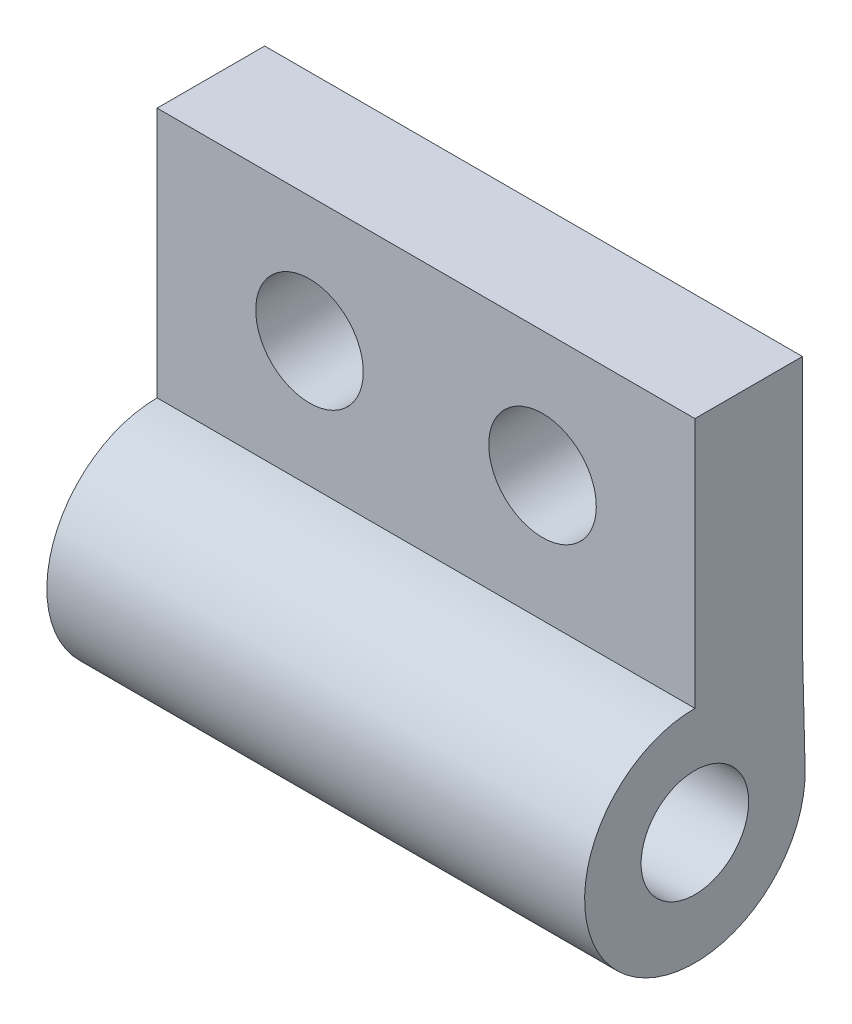
ISO-10303-21;
HEADER;
FILE_DESCRIPTION(('STEP AP214'),'2;1');
FILE_NAME('part.step','',(''),(''),'','','');
FILE_SCHEMA(('AUTOMOTIVE_DESIGN { 1 0 10303 214 1 1 1 1 }'));
ENDSEC;
DATA;
#1=APPLICATION_CONTEXT('core data for automotive mechanical design processes');
#2=APPLICATION_PROTOCOL_DEFINITION('international standard','automotive_design',2000,#1);
#3=PRODUCT_CONTEXT('',#1,'mechanical');
#4=PRODUCT('Part','Part','',(#3));
#5=PRODUCT_RELATED_PRODUCT_CATEGORY('part','',(#4));
#6=PRODUCT_DEFINITION_FORMATION('','',#4);
#7=PRODUCT_DEFINITION_CONTEXT('part definition',#1,'design');
#8=PRODUCT_DEFINITION('design','',#6,#7);
#9=PRODUCT_DEFINITION_SHAPE('','',#8);
#10=(LENGTH_UNIT() NAMED_UNIT(*) SI_UNIT(.MILLI.,.METRE.));
#11=(NAMED_UNIT(*) PLANE_ANGLE_UNIT() SI_UNIT($,.RADIAN.));
#12=(NAMED_UNIT(*) SI_UNIT($,.STERADIAN.) SOLID_ANGLE_UNIT());
#13=UNCERTAINTY_MEASURE_WITH_UNIT(LENGTH_MEASURE(1.E-05),#10,'distance_accuracy_value','');
#14=(GEOMETRIC_REPRESENTATION_CONTEXT(3) GLOBAL_UNCERTAINTY_ASSIGNED_CONTEXT((#13)) GLOBAL_UNIT_ASSIGNED_CONTEXT((#10,
#11,#12)) REPRESENTATION_CONTEXT('',''));
#15=CARTESIAN_POINT('',(0.,0.,0.));
#16=DIRECTION('',(0.,0.,1.));
#17=DIRECTION('',(1.,0.,0.));
#18=AXIS2_PLACEMENT_3D('',#15,#16,#17);
#19=CARTESIAN_POINT('',(0.,0.,3.));
#20=DIRECTION('',(0.,0.,1.));
#21=DIRECTION('',(1.,0.,0.));
#22=AXIS2_PLACEMENT_3D('',#19,#20,#21);
#23=PLANE('',#22);
#24=CARTESIAN_POINT('',(-3.25,0.,3.));
#25=DIRECTION('',(0.,0.,1.));
#26=DIRECTION('',(1.,0.,0.));
#27=AXIS2_PLACEMENT_3D('',#24,#25,#26);
#28=CIRCLE('',#27,1.5);
#29=CARTESIAN_POINT('',(-1.75,0.,3.));
#30=VERTEX_POINT('',#29);
#31=EDGE_CURVE('E123',#30,#30,#28,.T.);
#32=ORIENTED_EDGE('',*,*,#31,.F.);
#33=EDGE_LOOP('',(#32));
#34=FACE_BOUND('',#33,.T.);
#35=DIRECTION('',(0.,1.,0.));
#36=VECTOR('',#35,1.);
#37=CARTESIAN_POINT('',(7.5,3.5,3.));
#38=LINE('',#37,#36);
#39=CARTESIAN_POINT('',(7.5,-3.5,3.));
#40=VERTEX_POINT('',#39);
#41=CARTESIAN_POINT('',(7.5,3.5,3.));
#42=VERTEX_POINT('',#41);
#43=EDGE_CURVE('E105',#40,#42,#38,.T.);
#44=ORIENTED_EDGE('',*,*,#43,.T.);
#45=DIRECTION('',(-1.,0.,0.));
#46=VECTOR('',#45,1.);
#47=CARTESIAN_POINT('',(-7.5,3.5,3.));
#48=LINE('',#47,#46);
#49=CARTESIAN_POINT('',(-7.5,3.5,3.));
#50=VERTEX_POINT('',#49);
#51=EDGE_CURVE('E75',#42,#50,#48,.T.);
#52=ORIENTED_EDGE('',*,*,#51,.T.);
#53=DIRECTION('',(0.,-1.,0.));
#54=VECTOR('',#53,1.);
#55=CARTESIAN_POINT('',(-7.5,3.5,3.));
#56=LINE('',#55,#54);
#57=CARTESIAN_POINT('',(-7.5,-3.5,3.));
#58=VERTEX_POINT('',#57);
#59=EDGE_CURVE('E130',#50,#58,#56,.T.);
#60=ORIENTED_EDGE('',*,*,#59,.T.);
#61=DIRECTION('',(1.,0.,0.));
#62=VECTOR('',#61,1.);
#63=CARTESIAN_POINT('',(-7.5,-3.5,3.));
#64=LINE('',#63,#62);
#65=EDGE_CURVE('E50',#58,#40,#64,.T.);
#66=ORIENTED_EDGE('',*,*,#65,.T.);
#67=EDGE_LOOP('',(#44,#52,#60,#66));
#68=FACE_BOUND('',#67,.T.);
#69=CARTESIAN_POINT('',(3.25,0.,3.));
#70=DIRECTION('',(0.,0.,1.));
#71=DIRECTION('',(1.,0.,0.));
#72=AXIS2_PLACEMENT_3D('',#69,#70,#71);
#73=CIRCLE('',#72,1.5);
#74=CARTESIAN_POINT('',(4.75,0.,3.));
#75=VERTEX_POINT('',#74);
#76=EDGE_CURVE('E117',#75,#75,#73,.T.);
#77=ORIENTED_EDGE('',*,*,#76,.F.);
#78=EDGE_LOOP('',(#77));
#79=FACE_BOUND('',#78,.T.);
#80=ADVANCED_FACE('F33',(#34,#68,#79),#23,.T.);
#81=CARTESIAN_POINT('',(0.,0.,0.));
#82=DIRECTION('',(0.,0.,1.));
#83=DIRECTION('',(1.,0.,0.));
#84=AXIS2_PLACEMENT_3D('',#81,#82,#83);
#85=PLANE('',#84);
#86=DIRECTION('',(0.,1.,0.));
#87=VECTOR('',#86,1.);
#88=CARTESIAN_POINT('',(7.5,3.5,0.));
#89=LINE('',#88,#87);
#90=CARTESIAN_POINT('',(7.5,-3.5,0.));
#91=VERTEX_POINT('',#90);
#92=CARTESIAN_POINT('',(7.5,3.5,0.));
#93=VERTEX_POINT('',#92);
#94=EDGE_CURVE('E70',#91,#93,#89,.T.);
#95=ORIENTED_EDGE('',*,*,#94,.F.);
#96=DIRECTION('',(1.,0.,0.));
#97=VECTOR('',#96,1.);
#98=CARTESIAN_POINT('',(-7.5,-3.5,0.));
#99=LINE('',#98,#97);
#100=CARTESIAN_POINT('',(-7.5,-3.5,0.));
#101=VERTEX_POINT('',#100);
#102=EDGE_CURVE('E100',#101,#91,#99,.T.);
#103=ORIENTED_EDGE('',*,*,#102,.F.);
#104=DIRECTION('',(0.,-1.,0.));
#105=VECTOR('',#104,1.);
#106=CARTESIAN_POINT('',(-7.5,3.5,0.));
#107=LINE('',#106,#105);
#108=CARTESIAN_POINT('',(-7.5,3.5,0.));
#109=VERTEX_POINT('',#108);
#110=EDGE_CURVE('E135',#109,#101,#107,.T.);
#111=ORIENTED_EDGE('',*,*,#110,.F.);
#112=DIRECTION('',(-1.,0.,0.));
#113=VECTOR('',#112,1.);
#114=CARTESIAN_POINT('',(-7.5,3.5,0.));
#115=LINE('',#114,#113);
#116=EDGE_CURVE('E63',#93,#109,#115,.T.);
#117=ORIENTED_EDGE('',*,*,#116,.F.);
#118=EDGE_LOOP('',(#95,#103,#111,#117));
#119=FACE_BOUND('',#118,.T.);
#120=CARTESIAN_POINT('',(-3.25,0.,0.));
#121=DIRECTION('',(0.,0.,1.));
#122=DIRECTION('',(1.,0.,0.));
#123=AXIS2_PLACEMENT_3D('',#120,#121,#122);
#124=CIRCLE('',#123,1.5);
#125=CARTESIAN_POINT('',(-1.75,0.,0.));
#126=VERTEX_POINT('',#125);
#127=EDGE_CURVE('E120',#126,#126,#124,.T.);
#128=ORIENTED_EDGE('',*,*,#127,.T.);
#129=EDGE_LOOP('',(#128));
#130=FACE_BOUND('',#129,.T.);
#131=CARTESIAN_POINT('',(3.25,0.,0.));
#132=DIRECTION('',(0.,0.,1.));
#133=DIRECTION('',(1.,0.,0.));
#134=AXIS2_PLACEMENT_3D('',#131,#132,#133);
#135=CIRCLE('',#134,1.5);
#136=CARTESIAN_POINT('',(4.75,0.,0.));
#137=VERTEX_POINT('',#136);
#138=EDGE_CURVE('E115',#137,#137,#135,.T.);
#139=ORIENTED_EDGE('',*,*,#138,.T.);
#140=EDGE_LOOP('',(#139));
#141=FACE_BOUND('',#140,.T.);
#142=ADVANCED_FACE('F143',(#119,#130,#141),#85,.F.);
#143=CARTESIAN_POINT('',(7.5,3.5,3.));
#144=DIRECTION('',(-1.,0.,0.));
#145=DIRECTION('',(0.,0.,1.));
#146=AXIS2_PLACEMENT_3D('',#143,#144,#145);
#147=PLANE('',#146);
#148=ORIENTED_EDGE('',*,*,#94,.T.);
#149=DIRECTION('',(0.,0.,-1.));
#150=VECTOR('',#149,1.);
#151=CARTESIAN_POINT('',(7.5,3.5,3.));
#152=LINE('',#151,#150);
#153=EDGE_CURVE('E11',#42,#93,#152,.T.);
#154=ORIENTED_EDGE('',*,*,#153,.F.);
#155=ORIENTED_EDGE('',*,*,#43,.F.);
#156=CARTESIAN_POINT('',(7.5,-6.5753798207076,3.));
#157=DIRECTION('',(1.,0.,0.));
#158=DIRECTION('',(0.,0.,-1.));
#159=AXIS2_PLACEMENT_3D('',#156,#157,#158);
#160=CIRCLE('',#159,3.07537982070761);
#161=CARTESIAN_POINT('',(7.5,-6.49907661911802,-0.074433096205335));
#162=VERTEX_POINT('',#161);
#163=EDGE_CURVE('E91',#40,#162,#160,.T.);
#164=ORIENTED_EDGE('',*,*,#163,.T.);
#165=DIRECTION('',(0.,0.999692158989983,0.0248110308924696));
#166=VECTOR('',#165,1.);
#167=CARTESIAN_POINT('',(7.5,-3.5,0.));
#168=LINE('',#167,#166);
#169=EDGE_CURVE('E96',#162,#91,#168,.T.);
#170=ORIENTED_EDGE('',*,*,#169,.T.);
#171=EDGE_LOOP('',(#148,#154,#155,#164,#170));
#172=FACE_BOUND('',#171,.T.);
#173=CARTESIAN_POINT('',(7.5,-6.5,3.));
#174=DIRECTION('',(1.,0.,0.));
#175=DIRECTION('',(0.,0.,-1.));
#176=AXIS2_PLACEMENT_3D('',#173,#174,#175);
#177=CIRCLE('',#176,1.5);
#178=CARTESIAN_POINT('',(7.5,-6.5,1.5));
#179=VERTEX_POINT('',#178);
#180=EDGE_CURVE('E106',#179,#179,#177,.T.);
#181=ORIENTED_EDGE('',*,*,#180,.F.);
#182=EDGE_LOOP('',(#181));
#183=FACE_BOUND('',#182,.T.);
#184=ADVANCED_FACE('F35',(#172,#183),#147,.F.);
#185=CARTESIAN_POINT('',(-7.5,3.5,3.));
#186=DIRECTION('',(0.,-1.,0.));
#187=DIRECTION('',(0.,0.,-1.));
#188=AXIS2_PLACEMENT_3D('',#185,#186,#187);
#189=PLANE('',#188);
#190=ORIENTED_EDGE('',*,*,#116,.T.);
#191=DIRECTION('',(0.,0.,-1.));
#192=VECTOR('',#191,1.);
#193=CARTESIAN_POINT('',(-7.5,3.5,3.));
#194=LINE('',#193,#192);
#195=EDGE_CURVE('E42',#50,#109,#194,.T.);
#196=ORIENTED_EDGE('',*,*,#195,.F.);
#197=ORIENTED_EDGE('',*,*,#51,.F.);
#198=ORIENTED_EDGE('',*,*,#153,.T.);
#199=EDGE_LOOP('',(#190,#196,#197,#198));
#200=FACE_BOUND('',#199,.T.);
#201=ADVANCED_FACE('F145',(#200),#189,.F.);
#202=CARTESIAN_POINT('',(-7.5,3.5,3.));
#203=DIRECTION('',(1.,0.,0.));
#204=DIRECTION('',(0.,1.,0.));
#205=AXIS2_PLACEMENT_3D('',#202,#203,#204);
#206=PLANE('',#205);
#207=ORIENTED_EDGE('',*,*,#110,.T.);
#208=DIRECTION('',(0.,-0.999692158989983,-0.0248110308924696));
#209=VECTOR('',#208,1.);
#210=CARTESIAN_POINT('',(-7.5,-3.5,0.));
#211=LINE('',#210,#209);
#212=CARTESIAN_POINT('',(-7.5,-6.49907661911802,-0.074433096205335));
#213=VERTEX_POINT('',#212);
#214=EDGE_CURVE('E116',#101,#213,#211,.T.);
#215=ORIENTED_EDGE('',*,*,#214,.T.);
#216=CARTESIAN_POINT('',(-7.5,-6.5753798207076,3.));
#217=DIRECTION('',(1.,0.,0.));
#218=DIRECTION('',(0.,1.,0.));
#219=AXIS2_PLACEMENT_3D('',#216,#217,#218);
#220=CIRCLE('',#219,3.07537982070761);
#221=EDGE_CURVE('E93',#213,#58,#220,.F.);
#222=ORIENTED_EDGE('',*,*,#221,.T.);
#223=ORIENTED_EDGE('',*,*,#59,.F.);
#224=ORIENTED_EDGE('',*,*,#195,.T.);
#225=EDGE_LOOP('',(#207,#215,#222,#223,#224));
#226=FACE_BOUND('',#225,.T.);
#227=CARTESIAN_POINT('',(-7.5,-6.5,3.));
#228=DIRECTION('',(1.,0.,0.));
#229=DIRECTION('',(0.,1.,0.));
#230=AXIS2_PLACEMENT_3D('',#227,#228,#229);
#231=CIRCLE('',#230,1.5);
#232=CARTESIAN_POINT('',(-7.5,-5.,3.));
#233=VERTEX_POINT('',#232);
#234=EDGE_CURVE('E112',#233,#233,#231,.F.);
#235=ORIENTED_EDGE('',*,*,#234,.F.);
#236=EDGE_LOOP('',(#235));
#237=FACE_BOUND('',#236,.T.);
#238=ADVANCED_FACE('F141',(#226,#237),#206,.F.);
#239=CARTESIAN_POINT('',(-3.25,0.,3.));
#240=DIRECTION('',(0.,0.,-1.));
#241=DIRECTION('',(-1.,0.,0.));
#242=AXIS2_PLACEMENT_3D('',#239,#240,#241);
#243=CYLINDRICAL_SURFACE('',#242,1.5);
#244=ORIENTED_EDGE('',*,*,#31,.T.);
#245=EDGE_LOOP('',(#244));
#246=FACE_BOUND('',#245,.T.);
#247=ORIENTED_EDGE('',*,*,#127,.F.);
#248=EDGE_LOOP('',(#247));
#249=FACE_BOUND('',#248,.T.);
#250=ADVANCED_FACE('F151',(#246,#249),#243,.F.);
#251=CARTESIAN_POINT('',(3.25,0.,3.));
#252=DIRECTION('',(0.,0.,-1.));
#253=DIRECTION('',(-1.,0.,0.));
#254=AXIS2_PLACEMENT_3D('',#251,#252,#253);
#255=CYLINDRICAL_SURFACE('',#254,1.5);
#256=ORIENTED_EDGE('',*,*,#76,.T.);
#257=EDGE_LOOP('',(#256));
#258=FACE_BOUND('',#257,.T.);
#259=ORIENTED_EDGE('',*,*,#138,.F.);
#260=EDGE_LOOP('',(#259));
#261=FACE_BOUND('',#260,.T.);
#262=ADVANCED_FACE('F164',(#258,#261),#255,.F.);
#263=CARTESIAN_POINT('',(-16.1984877037865,-3.5,0.));
#264=DIRECTION('',(0.,0.0248110308924695,-0.999692158989983));
#265=DIRECTION('',(0.,0.999692158989983,0.0248110308924696));
#266=AXIS2_PLACEMENT_3D('',#263,#264,#265);
#267=PLANE('',#266);
#268=ORIENTED_EDGE('',*,*,#214,.F.);
#269=ORIENTED_EDGE('',*,*,#102,.T.);
#270=ORIENTED_EDGE('',*,*,#169,.F.);
#271=DIRECTION('',(1.,0.,0.));
#272=VECTOR('',#271,1.);
#273=CARTESIAN_POINT('',(-16.1984877037865,-6.49907661911802,-0.074433096205335));
#274=LINE('',#273,#272);
#275=EDGE_CURVE('E87',#213,#162,#274,.T.);
#276=ORIENTED_EDGE('',*,*,#275,.F.);
#277=EDGE_LOOP('',(#268,#269,#270,#276));
#278=FACE_BOUND('',#277,.T.);
#279=ADVANCED_FACE('F99',(#278),#267,.T.);
#280=CARTESIAN_POINT('',(-16.1984877037865,-6.5753798207076,3.));
#281=DIRECTION('',(1.,0.,0.));
#282=DIRECTION('',(0.,0.,-1.));
#283=AXIS2_PLACEMENT_3D('',#280,#281,#282);
#284=CYLINDRICAL_SURFACE('',#283,3.07537982070761);
#285=ORIENTED_EDGE('',*,*,#221,.F.);
#286=ORIENTED_EDGE('',*,*,#275,.T.);
#287=ORIENTED_EDGE('',*,*,#163,.F.);
#288=ORIENTED_EDGE('',*,*,#65,.F.);
#289=EDGE_LOOP('',(#285,#286,#287,#288));
#290=FACE_BOUND('',#289,.T.);
#291=ADVANCED_FACE('F89',(#290),#284,.T.);
#292=CARTESIAN_POINT('',(-16.1984877037865,-6.5,3.));
#293=DIRECTION('',(1.,0.,0.));
#294=DIRECTION('',(0.,0.,-1.));
#295=AXIS2_PLACEMENT_3D('',#292,#293,#294);
#296=CYLINDRICAL_SURFACE('',#295,1.5);
#297=ORIENTED_EDGE('',*,*,#234,.T.);
#298=EDGE_LOOP('',(#297));
#299=FACE_BOUND('',#298,.T.);
#300=ORIENTED_EDGE('',*,*,#180,.T.);
#301=EDGE_LOOP('',(#300));
#302=FACE_BOUND('',#301,.T.);
#303=ADVANCED_FACE('F171',(#299,#302),#296,.F.);
#304=CLOSED_SHELL('',(#80,#142,#184,#201,#238,#250,#262,#279,#291,#303));
#305=MANIFOLD_SOLID_BREP('B2',#304);
#306=ADVANCED_BREP_SHAPE_REPRESENTATION('',(#18,#305),#14);
#307=SHAPE_DEFINITION_REPRESENTATION(#9,#306);
ENDSEC;
END-ISO-10303-21;
